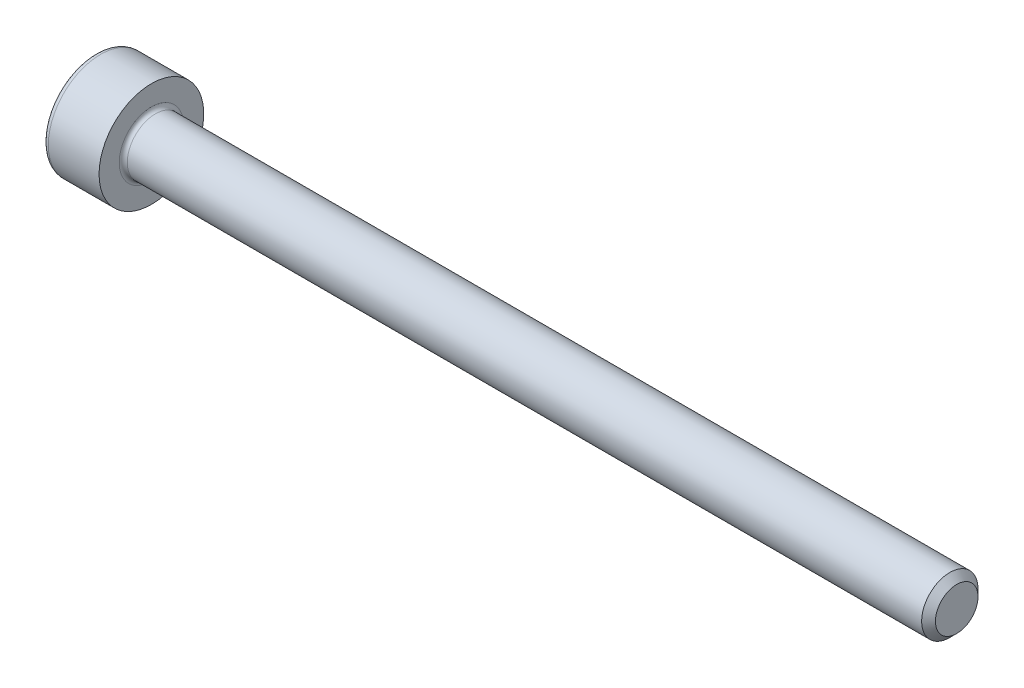
ISO-10303-21;
HEADER;
FILE_DESCRIPTION(('STEP AP214'),'2;1');
FILE_NAME('part.step','',(''),(''),'','','');
FILE_SCHEMA(('AUTOMOTIVE_DESIGN { 1 0 10303 214 1 1 1 1 }'));
ENDSEC;
DATA;
#1=APPLICATION_CONTEXT('core data for automotive mechanical design processes');
#2=APPLICATION_PROTOCOL_DEFINITION('international standard','automotive_design',2000,#1);
#3=PRODUCT_CONTEXT('',#1,'mechanical');
#4=PRODUCT('Part','Part','',(#3));
#5=PRODUCT_RELATED_PRODUCT_CATEGORY('part','',(#4));
#6=PRODUCT_DEFINITION_FORMATION('','',#4);
#7=PRODUCT_DEFINITION_CONTEXT('part definition',#1,'design');
#8=PRODUCT_DEFINITION('design','',#6,#7);
#9=PRODUCT_DEFINITION_SHAPE('','',#8);
#10=(LENGTH_UNIT() NAMED_UNIT(*) SI_UNIT(.MILLI.,.METRE.));
#11=(NAMED_UNIT(*) PLANE_ANGLE_UNIT() SI_UNIT($,.RADIAN.));
#12=(NAMED_UNIT(*) SI_UNIT($,.STERADIAN.) SOLID_ANGLE_UNIT());
#13=UNCERTAINTY_MEASURE_WITH_UNIT(LENGTH_MEASURE(1.E-05),#10,'distance_accuracy_value','');
#14=(GEOMETRIC_REPRESENTATION_CONTEXT(3) GLOBAL_UNCERTAINTY_ASSIGNED_CONTEXT((#13)) GLOBAL_UNIT_ASSIGNED_CONTEXT((#10,
#11,#12)) REPRESENTATION_CONTEXT('',''));
#15=CARTESIAN_POINT('',(0.,0.,0.));
#16=DIRECTION('',(0.,0.,1.));
#17=DIRECTION('',(1.,0.,0.));
#18=AXIS2_PLACEMENT_3D('',#15,#16,#17);
#19=CARTESIAN_POINT('',(0.,0.,0.));
#20=DIRECTION('',(-1.,0.,0.));
#21=DIRECTION('',(0.,0.,1.));
#22=AXIS2_PLACEMENT_3D('',#19,#20,#21);
#23=PLANE('',#22);
#24=DIRECTION('',(0.,-0.499999999999998,0.86602540378444));
#25=VECTOR('',#24,1.);
#26=CARTESIAN_POINT('',(0.,0.7621023553303,0.));
#27=LINE('',#26,#25);
#28=CARTESIAN_POINT('',(0.,0.7621023553303,0.));
#29=VERTEX_POINT('',#28);
#30=CARTESIAN_POINT('',(0.,0.381051177665149,0.659999999999998));
#31=VERTEX_POINT('',#30);
#32=EDGE_CURVE('E292',#29,#31,#27,.T.);
#33=ORIENTED_EDGE('',*,*,#32,.T.);
#34=DIRECTION('',(0.,1.,0.));
#35=VECTOR('',#34,1.);
#36=CARTESIAN_POINT('',(0.,-0.381051177665157,0.659999999999998));
#37=LINE('',#36,#35);
#38=CARTESIAN_POINT('',(0.,-0.381051177665157,0.659999999999998));
#39=VERTEX_POINT('',#38);
#40=EDGE_CURVE('E136',#39,#31,#37,.T.);
#41=ORIENTED_EDGE('',*,*,#40,.F.);
#42=DIRECTION('',(0.,-0.500000000000001,-0.866025403784438));
#43=VECTOR('',#42,1.);
#44=CARTESIAN_POINT('',(0.,-0.381051177665157,0.659999999999998));
#45=LINE('',#44,#43);
#46=CARTESIAN_POINT('',(0.,-0.76210235533031,0.));
#47=VERTEX_POINT('',#46);
#48=EDGE_CURVE('E297',#39,#47,#45,.T.);
#49=ORIENTED_EDGE('',*,*,#48,.T.);
#50=DIRECTION('',(0.,0.499999999999998,-0.86602540378444));
#51=VECTOR('',#50,1.);
#52=CARTESIAN_POINT('',(0.,-0.76210235533031,0.));
#53=LINE('',#52,#51);
#54=CARTESIAN_POINT('',(0.,-0.381051177665159,-0.660000000000002));
#55=VERTEX_POINT('',#54);
#56=EDGE_CURVE('E301',#47,#55,#53,.T.);
#57=ORIENTED_EDGE('',*,*,#56,.T.);
#58=DIRECTION('',(0.,-1.,0.));
#59=VECTOR('',#58,1.);
#60=CARTESIAN_POINT('',(0.,0.381051177665146,-0.660000000000002));
#61=LINE('',#60,#59);
#62=CARTESIAN_POINT('',(0.,0.381051177665146,-0.660000000000002));
#63=VERTEX_POINT('',#62);
#64=EDGE_CURVE('E305',#63,#55,#61,.T.);
#65=ORIENTED_EDGE('',*,*,#64,.F.);
#66=DIRECTION('',(0.,-0.500000000000001,-0.866025403784438));
#67=VECTOR('',#66,1.);
#68=CARTESIAN_POINT('',(0.,0.7621023553303,0.));
#69=LINE('',#68,#67);
#70=EDGE_CURVE('E131',#29,#63,#69,.T.);
#71=ORIENTED_EDGE('',*,*,#70,.F.);
#72=EDGE_LOOP('',(#33,#41,#49,#57,#65,#71));
#73=FACE_BOUND('',#72,.T.);
#74=CARTESIAN_POINT('',(0.,0.,0.));
#75=DIRECTION('',(-1.,0.,0.));
#76=DIRECTION('',(0.,0.,1.));
#77=AXIS2_PLACEMENT_3D('',#74,#75,#76);
#78=CIRCLE('',#77,1.16);
#79=CARTESIAN_POINT('',(0.,0.,1.16));
#80=VERTEX_POINT('',#79);
#81=EDGE_CURVE('E50',#80,#80,#78,.T.);
#82=ORIENTED_EDGE('',*,*,#81,.T.);
#83=EDGE_LOOP('',(#82));
#84=FACE_BOUND('',#83,.T.);
#85=ADVANCED_FACE('F41',(#73,#84),#23,.T.);
#86=CARTESIAN_POINT('',(-31.75,0.,0.));
#87=DIRECTION('',(-1.,0.,0.));
#88=DIRECTION('',(0.,0.,1.));
#89=AXIS2_PLACEMENT_3D('',#86,#87,#88);
#90=CYLINDRICAL_SURFACE('',#89,1.3);
#91=CARTESIAN_POINT('',(0.140000000000001,0.,0.));
#92=DIRECTION('',(-1.,0.,0.));
#93=DIRECTION('',(0.,0.,1.));
#94=AXIS2_PLACEMENT_3D('',#91,#92,#93);
#95=CIRCLE('',#94,1.3);
#96=CARTESIAN_POINT('',(0.140000000000001,0.,1.3));
#97=VERTEX_POINT('',#96);
#98=EDGE_CURVE('E11',#97,#97,#95,.F.);
#99=ORIENTED_EDGE('',*,*,#98,.T.);
#100=EDGE_LOOP('',(#99));
#101=FACE_BOUND('',#100,.T.);
#102=CARTESIAN_POINT('',(1.4,0.,0.));
#103=DIRECTION('',(-1.,0.,0.));
#104=DIRECTION('',(0.,0.,1.));
#105=AXIS2_PLACEMENT_3D('',#102,#103,#104);
#106=CIRCLE('',#105,1.3);
#107=CARTESIAN_POINT('',(1.4,0.,1.3));
#108=VERTEX_POINT('',#107);
#109=EDGE_CURVE('E160',#108,#108,#106,.T.);
#110=ORIENTED_EDGE('',*,*,#109,.T.);
#111=EDGE_LOOP('',(#110));
#112=FACE_BOUND('',#111,.T.);
#113=ADVANCED_FACE('F188',(#101,#112),#90,.T.);
#114=CARTESIAN_POINT('',(1.4,1.3,0.));
#115=DIRECTION('',(1.,0.,0.));
#116=DIRECTION('',(0.,0.,-1.));
#117=AXIS2_PLACEMENT_3D('',#114,#115,#116);
#118=PLANE('',#117);
#119=CARTESIAN_POINT('',(1.4,0.,0.));
#120=DIRECTION('',(1.,0.,0.));
#121=DIRECTION('',(0.,0.,-1.));
#122=AXIS2_PLACEMENT_3D('',#119,#120,#121);
#123=CIRCLE('',#122,0.799999999999998);
#124=CARTESIAN_POINT('',(1.4,0.,-0.799999999999998));
#125=VERTEX_POINT('',#124);
#126=EDGE_CURVE('E164',#125,#125,#123,.F.);
#127=ORIENTED_EDGE('',*,*,#126,.T.);
#128=EDGE_LOOP('',(#127));
#129=FACE_BOUND('',#128,.T.);
#130=ORIENTED_EDGE('',*,*,#109,.F.);
#131=EDGE_LOOP('',(#130));
#132=FACE_BOUND('',#131,.T.);
#133=ADVANCED_FACE('F194',(#129,#132),#118,.T.);
#134=CARTESIAN_POINT('',(-31.75,0.,0.));
#135=DIRECTION('',(-1.,0.,0.));
#136=DIRECTION('',(0.,0.,1.));
#137=AXIS2_PLACEMENT_3D('',#134,#135,#136);
#138=CYLINDRICAL_SURFACE('',#137,0.699999999999998);
#139=CARTESIAN_POINT('',(1.5,0.,0.));
#140=DIRECTION('',(1.,0.,0.));
#141=DIRECTION('',(0.,0.,-1.));
#142=AXIS2_PLACEMENT_3D('',#139,#140,#141);
#143=CIRCLE('',#142,0.699999999999998);
#144=CARTESIAN_POINT('',(1.5,0.,-0.699999999999998));
#145=VERTEX_POINT('',#144);
#146=EDGE_CURVE('E168',#145,#145,#143,.T.);
#147=ORIENTED_EDGE('',*,*,#146,.T.);
#148=EDGE_LOOP('',(#147));
#149=FACE_BOUND('',#148,.T.);
#150=CARTESIAN_POINT('',(21.2285,0.,0.));
#151=DIRECTION('',(-1.,0.,0.));
#152=DIRECTION('',(0.,0.,1.));
#153=AXIS2_PLACEMENT_3D('',#150,#151,#152);
#154=CIRCLE('',#153,0.699999999999997);
#155=CARTESIAN_POINT('',(21.2285,0.,0.699999999999997));
#156=VERTEX_POINT('',#155);
#157=EDGE_CURVE('E156',#156,#156,#154,.T.);
#158=ORIENTED_EDGE('',*,*,#157,.T.);
#159=EDGE_LOOP('',(#158));
#160=FACE_BOUND('',#159,.T.);
#161=ADVANCED_FACE('F200',(#149,#160),#138,.T.);
#162=CARTESIAN_POINT('',(21.4,0.,0.));
#163=DIRECTION('',(-1.,0.,0.));
#164=DIRECTION('',(0.,0.,1.));
#165=AXIS2_PLACEMENT_3D('',#162,#163,#164);
#166=CONICAL_SURFACE('',#165,0.5285,0.785398163397426);
#167=ORIENTED_EDGE('',*,*,#157,.F.);
#168=EDGE_LOOP('',(#167));
#169=FACE_BOUND('',#168,.T.);
#170=CARTESIAN_POINT('',(21.4,0.,0.));
#171=DIRECTION('',(-1.,0.,0.));
#172=DIRECTION('',(0.,0.,1.));
#173=AXIS2_PLACEMENT_3D('',#170,#171,#172);
#174=CIRCLE('',#173,0.5285);
#175=CARTESIAN_POINT('',(21.4,0.,0.5285));
#176=VERTEX_POINT('',#175);
#177=EDGE_CURVE('E151',#176,#176,#174,.T.);
#178=ORIENTED_EDGE('',*,*,#177,.T.);
#179=EDGE_LOOP('',(#178));
#180=FACE_BOUND('',#179,.T.);
#181=ADVANCED_FACE('F204',(#169,#180),#166,.T.);
#182=CARTESIAN_POINT('',(21.4,0.5285,0.));
#183=DIRECTION('',(1.,0.,0.));
#184=DIRECTION('',(0.,0.,-1.));
#185=AXIS2_PLACEMENT_3D('',#182,#183,#184);
#186=PLANE('',#185);
#187=ORIENTED_EDGE('',*,*,#177,.F.);
#188=EDGE_LOOP('',(#187));
#189=FACE_BOUND('',#188,.T.);
#190=ADVANCED_FACE('F184',(#189),#186,.T.);
#191=CARTESIAN_POINT('',(1.5,0.,0.));
#192=DIRECTION('',(1.,0.,0.));
#193=DIRECTION('',(0.,0.,-1.));
#194=AXIS2_PLACEMENT_3D('',#191,#192,#193);
#195=TOROIDAL_SURFACE('',#194,0.799999999999998,0.1);
#196=ORIENTED_EDGE('',*,*,#146,.F.);
#197=EDGE_LOOP('',(#196));
#198=FACE_BOUND('',#197,.T.);
#199=ORIENTED_EDGE('',*,*,#126,.F.);
#200=EDGE_LOOP('',(#199));
#201=FACE_BOUND('',#200,.T.);
#202=ADVANCED_FACE('F177',(#198,#201),#195,.F.);
#203=CARTESIAN_POINT('',(0.140000000000001,0.,0.));
#204=DIRECTION('',(-1.,0.,0.));
#205=DIRECTION('',(0.,0.,1.));
#206=AXIS2_PLACEMENT_3D('',#203,#204,#205);
#207=TOROIDAL_SURFACE('',#206,1.16,0.14);
#208=ORIENTED_EDGE('',*,*,#98,.F.);
#209=EDGE_LOOP('',(#208));
#210=FACE_BOUND('',#209,.T.);
#211=ORIENTED_EDGE('',*,*,#81,.F.);
#212=EDGE_LOOP('',(#211));
#213=FACE_BOUND('',#212,.T.);
#214=ADVANCED_FACE('F43',(#210,#213),#207,.T.);
#215=CARTESIAN_POINT('',(0.6,0.7621023553303,0.));
#216=DIRECTION('',(0.,-0.86602540378444,-0.499999999999998));
#217=DIRECTION('',(0.,0.499999999999998,-0.86602540378444));
#218=AXIS2_PLACEMENT_3D('',#215,#216,#217);
#219=PLANE('',#218);
#220=ORIENTED_EDGE('',*,*,#32,.F.);
#221=DIRECTION('',(-1.,0.,0.));
#222=VECTOR('',#221,1.);
#223=CARTESIAN_POINT('',(0.6,0.7621023553303,0.));
#224=LINE('',#223,#222);
#225=CARTESIAN_POINT('',(0.6,0.7621023553303,0.));
#226=VERTEX_POINT('',#225);
#227=EDGE_CURVE('E291',#226,#29,#224,.T.);
#228=ORIENTED_EDGE('',*,*,#227,.F.);
#229=DIRECTION('',(0.,-0.499999999999998,0.86602540378444));
#230=VECTOR('',#229,1.);
#231=CARTESIAN_POINT('',(0.6,0.7621023553303,0.));
#232=LINE('',#231,#230);
#233=CARTESIAN_POINT('',(0.6,0.57157676649773,0.329999999999998));
#234=VERTEX_POINT('',#233);
#235=EDGE_CURVE('E57',#226,#234,#232,.T.);
#236=ORIENTED_EDGE('',*,*,#235,.T.);
#237=CARTESIAN_POINT('',(0.6,0.381051177665149,0.659999999999998));
#238=VERTEX_POINT('',#237);
#239=EDGE_CURVE('E115',#234,#238,#232,.T.);
#240=ORIENTED_EDGE('',*,*,#239,.T.);
#241=DIRECTION('',(-1.,0.,0.));
#242=VECTOR('',#241,1.);
#243=CARTESIAN_POINT('',(0.6,0.381051177665149,0.659999999999998));
#244=LINE('',#243,#242);
#245=EDGE_CURVE('E128',#238,#31,#244,.T.);
#246=ORIENTED_EDGE('',*,*,#245,.T.);
#247=EDGE_LOOP('',(#220,#228,#236,#240,#246));
#248=FACE_BOUND('',#247,.T.);
#249=ADVANCED_FACE('F127',(#248),#219,.T.);
#250=CARTESIAN_POINT('',(0.6,-0.381051177665157,0.659999999999998));
#251=DIRECTION('',(0.,0.,1.));
#252=DIRECTION('',(0.,-1.,0.));
#253=AXIS2_PLACEMENT_3D('',#250,#251,#252);
#254=PLANE('',#253);
#255=ORIENTED_EDGE('',*,*,#40,.T.);
#256=ORIENTED_EDGE('',*,*,#245,.F.);
#257=DIRECTION('',(0.,1.,0.));
#258=VECTOR('',#257,1.);
#259=CARTESIAN_POINT('',(0.6,-0.381051177665157,0.659999999999998));
#260=LINE('',#259,#258);
#261=CARTESIAN_POINT('',(0.6,0.,0.659999999999998));
#262=VERTEX_POINT('',#261);
#263=EDGE_CURVE('E113',#262,#238,#260,.T.);
#264=ORIENTED_EDGE('',*,*,#263,.F.);
#265=CARTESIAN_POINT('',(0.6,-0.381051177665157,0.659999999999998));
#266=VERTEX_POINT('',#265);
#267=EDGE_CURVE('E124',#266,#262,#260,.T.);
#268=ORIENTED_EDGE('',*,*,#267,.F.);
#269=DIRECTION('',(-1.,0.,0.));
#270=VECTOR('',#269,1.);
#271=CARTESIAN_POINT('',(0.6,-0.381051177665157,0.659999999999998));
#272=LINE('',#271,#270);
#273=EDGE_CURVE('E139',#266,#39,#272,.T.);
#274=ORIENTED_EDGE('',*,*,#273,.T.);
#275=EDGE_LOOP('',(#255,#256,#264,#268,#274));
#276=FACE_BOUND('',#275,.T.);
#277=ADVANCED_FACE('F133',(#276),#254,.F.);
#278=CARTESIAN_POINT('',(0.6,-0.381051177665157,0.659999999999998));
#279=DIRECTION('',(0.,0.866025403784438,-0.500000000000001));
#280=DIRECTION('',(0.,0.500000000000001,0.866025403784438));
#281=AXIS2_PLACEMENT_3D('',#278,#279,#280);
#282=PLANE('',#281);
#283=ORIENTED_EDGE('',*,*,#48,.F.);
#284=ORIENTED_EDGE('',*,*,#273,.F.);
#285=DIRECTION('',(0.,-0.500000000000001,-0.866025403784438));
#286=VECTOR('',#285,1.);
#287=CARTESIAN_POINT('',(0.6,-0.381051177665157,0.659999999999998));
#288=LINE('',#287,#286);
#289=CARTESIAN_POINT('',(0.6,-0.571576766497731,0.330000000000002));
#290=VERTEX_POINT('',#289);
#291=EDGE_CURVE('E266',#266,#290,#288,.T.);
#292=ORIENTED_EDGE('',*,*,#291,.T.);
#293=CARTESIAN_POINT('',(0.6,-0.76210235533031,0.));
#294=VERTEX_POINT('',#293);
#295=EDGE_CURVE('E268',#290,#294,#288,.T.);
#296=ORIENTED_EDGE('',*,*,#295,.T.);
#297=DIRECTION('',(-1.,0.,0.));
#298=VECTOR('',#297,1.);
#299=CARTESIAN_POINT('',(0.6,-0.76210235533031,0.));
#300=LINE('',#299,#298);
#301=EDGE_CURVE('E146',#294,#47,#300,.T.);
#302=ORIENTED_EDGE('',*,*,#301,.T.);
#303=EDGE_LOOP('',(#283,#284,#292,#296,#302));
#304=FACE_BOUND('',#303,.T.);
#305=ADVANCED_FACE('F217',(#304),#282,.T.);
#306=CARTESIAN_POINT('',(0.6,-0.76210235533031,0.));
#307=DIRECTION('',(0.,0.86602540378444,0.499999999999998));
#308=DIRECTION('',(0.,-0.499999999999998,0.86602540378444));
#309=AXIS2_PLACEMENT_3D('',#306,#307,#308);
#310=PLANE('',#309);
#311=ORIENTED_EDGE('',*,*,#56,.F.);
#312=ORIENTED_EDGE('',*,*,#301,.F.);
#313=DIRECTION('',(0.,0.499999999999998,-0.86602540378444));
#314=VECTOR('',#313,1.);
#315=CARTESIAN_POINT('',(0.6,-0.76210235533031,0.));
#316=LINE('',#315,#314);
#317=CARTESIAN_POINT('',(0.6,-0.571576766497735,-0.330000000000001));
#318=VERTEX_POINT('',#317);
#319=EDGE_CURVE('E271',#294,#318,#316,.T.);
#320=ORIENTED_EDGE('',*,*,#319,.T.);
#321=CARTESIAN_POINT('',(0.6,-0.381051177665159,-0.660000000000002));
#322=VERTEX_POINT('',#321);
#323=EDGE_CURVE('E277',#318,#322,#316,.T.);
#324=ORIENTED_EDGE('',*,*,#323,.T.);
#325=DIRECTION('',(-1.,0.,0.));
#326=VECTOR('',#325,1.);
#327=CARTESIAN_POINT('',(0.6,-0.381051177665159,-0.660000000000002));
#328=LINE('',#327,#326);
#329=EDGE_CURVE('E318',#322,#55,#328,.T.);
#330=ORIENTED_EDGE('',*,*,#329,.T.);
#331=EDGE_LOOP('',(#311,#312,#320,#324,#330));
#332=FACE_BOUND('',#331,.T.);
#333=ADVANCED_FACE('F220',(#332),#310,.T.);
#334=CARTESIAN_POINT('',(0.6,0.381051177665146,-0.660000000000002));
#335=DIRECTION('',(0.,0.,-1.));
#336=DIRECTION('',(0.,1.,0.));
#337=AXIS2_PLACEMENT_3D('',#334,#335,#336);
#338=PLANE('',#337);
#339=ORIENTED_EDGE('',*,*,#64,.T.);
#340=ORIENTED_EDGE('',*,*,#329,.F.);
#341=DIRECTION('',(0.,-1.,0.));
#342=VECTOR('',#341,1.);
#343=CARTESIAN_POINT('',(0.6,0.381051177665146,-0.660000000000002));
#344=LINE('',#343,#342);
#345=CARTESIAN_POINT('',(0.6,0.,-0.660000000000002));
#346=VERTEX_POINT('',#345);
#347=EDGE_CURVE('E283',#346,#322,#344,.T.);
#348=ORIENTED_EDGE('',*,*,#347,.F.);
#349=CARTESIAN_POINT('',(0.6,0.381051177665146,-0.660000000000002));
#350=VERTEX_POINT('',#349);
#351=EDGE_CURVE('E284',#350,#346,#344,.T.);
#352=ORIENTED_EDGE('',*,*,#351,.F.);
#353=DIRECTION('',(-1.,0.,0.));
#354=VECTOR('',#353,1.);
#355=CARTESIAN_POINT('',(0.6,0.381051177665146,-0.660000000000002));
#356=LINE('',#355,#354);
#357=EDGE_CURVE('E314',#350,#63,#356,.T.);
#358=ORIENTED_EDGE('',*,*,#357,.T.);
#359=EDGE_LOOP('',(#339,#340,#348,#352,#358));
#360=FACE_BOUND('',#359,.T.);
#361=ADVANCED_FACE('F224',(#360),#338,.F.);
#362=CARTESIAN_POINT('',(0.6,0.7621023553303,0.));
#363=DIRECTION('',(0.,0.866025403784438,-0.500000000000001));
#364=DIRECTION('',(0.,0.500000000000001,0.866025403784438));
#365=AXIS2_PLACEMENT_3D('',#362,#363,#364);
#366=PLANE('',#365);
#367=ORIENTED_EDGE('',*,*,#70,.T.);
#368=ORIENTED_EDGE('',*,*,#357,.F.);
#369=DIRECTION('',(0.,-0.500000000000001,-0.866025403784438));
#370=VECTOR('',#369,1.);
#371=CARTESIAN_POINT('',(0.6,0.7621023553303,0.));
#372=LINE('',#371,#370);
#373=CARTESIAN_POINT('',(0.6,0.571576766497725,-0.329999999999998));
#374=VERTEX_POINT('',#373);
#375=EDGE_CURVE('E288',#374,#350,#372,.T.);
#376=ORIENTED_EDGE('',*,*,#375,.F.);
#377=EDGE_CURVE('E256',#226,#374,#372,.T.);
#378=ORIENTED_EDGE('',*,*,#377,.F.);
#379=ORIENTED_EDGE('',*,*,#227,.T.);
#380=EDGE_LOOP('',(#367,#368,#376,#378,#379));
#381=FACE_BOUND('',#380,.T.);
#382=ADVANCED_FACE('F228',(#381),#366,.F.);
#383=CARTESIAN_POINT('',(0.6,0.381051177665149,0.659999999999998));
#384=DIRECTION('',(-1.,0.,0.));
#385=DIRECTION('',(0.,0.,1.));
#386=AXIS2_PLACEMENT_3D('',#383,#384,#385);
#387=PLANE('',#386);
#388=CARTESIAN_POINT('',(0.6,0.,0.));
#389=DIRECTION('',(-1.,0.,0.));
#390=DIRECTION('',(0.,0.,1.));
#391=AXIS2_PLACEMENT_3D('',#388,#389,#390);
#392=CIRCLE('',#391,0.659999999999999);
#393=EDGE_CURVE('E138',#290,#262,#392,.T.);
#394=ORIENTED_EDGE('',*,*,#393,.F.);
#395=ORIENTED_EDGE('',*,*,#291,.F.);
#396=ORIENTED_EDGE('',*,*,#267,.T.);
#397=EDGE_LOOP('',(#394,#395,#396));
#398=FACE_BOUND('',#397,.T.);
#399=ADVANCED_FACE('F232',(#398),#387,.T.);
#400=EDGE_CURVE('E144',#318,#290,#392,.T.);
#401=ORIENTED_EDGE('',*,*,#400,.F.);
#402=ORIENTED_EDGE('',*,*,#319,.F.);
#403=ORIENTED_EDGE('',*,*,#295,.F.);
#404=EDGE_LOOP('',(#401,#402,#403));
#405=FACE_BOUND('',#404,.T.);
#406=ADVANCED_FACE('F235',(#405),#387,.T.);
#407=EDGE_CURVE('E330',#346,#318,#392,.T.);
#408=ORIENTED_EDGE('',*,*,#407,.F.);
#409=ORIENTED_EDGE('',*,*,#347,.T.);
#410=ORIENTED_EDGE('',*,*,#323,.F.);
#411=EDGE_LOOP('',(#408,#409,#410));
#412=FACE_BOUND('',#411,.T.);
#413=ADVANCED_FACE('F240',(#412),#387,.T.);
#414=EDGE_CURVE('E260',#374,#346,#392,.T.);
#415=ORIENTED_EDGE('',*,*,#414,.F.);
#416=ORIENTED_EDGE('',*,*,#375,.T.);
#417=ORIENTED_EDGE('',*,*,#351,.T.);
#418=EDGE_LOOP('',(#415,#416,#417));
#419=FACE_BOUND('',#418,.T.);
#420=ADVANCED_FACE('F247',(#419),#387,.T.);
#421=EDGE_CURVE('E152',#234,#374,#392,.T.);
#422=ORIENTED_EDGE('',*,*,#421,.F.);
#423=ORIENTED_EDGE('',*,*,#235,.F.);
#424=ORIENTED_EDGE('',*,*,#377,.T.);
#425=EDGE_LOOP('',(#422,#423,#424));
#426=FACE_BOUND('',#425,.T.);
#427=ADVANCED_FACE('F243',(#426),#387,.T.);
#428=EDGE_CURVE('E118',#262,#234,#392,.T.);
#429=ORIENTED_EDGE('',*,*,#428,.F.);
#430=ORIENTED_EDGE('',*,*,#263,.T.);
#431=ORIENTED_EDGE('',*,*,#239,.F.);
#432=EDGE_LOOP('',(#429,#430,#431));
#433=FACE_BOUND('',#432,.T.);
#434=ADVANCED_FACE('F114',(#433),#387,.T.);
#435=CARTESIAN_POINT('',(0.6,0.,0.));
#436=DIRECTION('',(-1.,0.,0.));
#437=DIRECTION('',(0.,0.,1.));
#438=AXIS2_PLACEMENT_3D('',#435,#436,#437);
#439=CONICAL_SURFACE('',#438,0.659999999999999,1.04719755119658);
#440=CARTESIAN_POINT('',(0.981051177665164,0.,0.));
#441=VERTEX_POINT('',#440);
#442=VERTEX_LOOP('',#441);
#443=FACE_BOUND('',#442,.T.);
#444=ORIENTED_EDGE('',*,*,#428,.T.);
#445=ORIENTED_EDGE('',*,*,#421,.T.);
#446=ORIENTED_EDGE('',*,*,#414,.T.);
#447=ORIENTED_EDGE('',*,*,#407,.T.);
#448=ORIENTED_EDGE('',*,*,#400,.T.);
#449=ORIENTED_EDGE('',*,*,#393,.T.);
#450=EDGE_LOOP('',(#444,#445,#446,#447,#448,#449));
#451=FACE_BOUND('',#450,.T.);
#452=ADVANCED_FACE('F212',(#443,#451),#439,.F.);
#453=CLOSED_SHELL('',(#85,#113,#133,#161,#181,#190,#202,#214,#249,#277,#305,#333,#361,#382,#399,
#406,#413,#420,#427,#434,#452));
#454=MANIFOLD_SOLID_BREP('B2',#453);
#455=ADVANCED_BREP_SHAPE_REPRESENTATION('',(#18,#454),#14);
#456=SHAPE_DEFINITION_REPRESENTATION(#9,#455);
ENDSEC;
END-ISO-10303-21;
